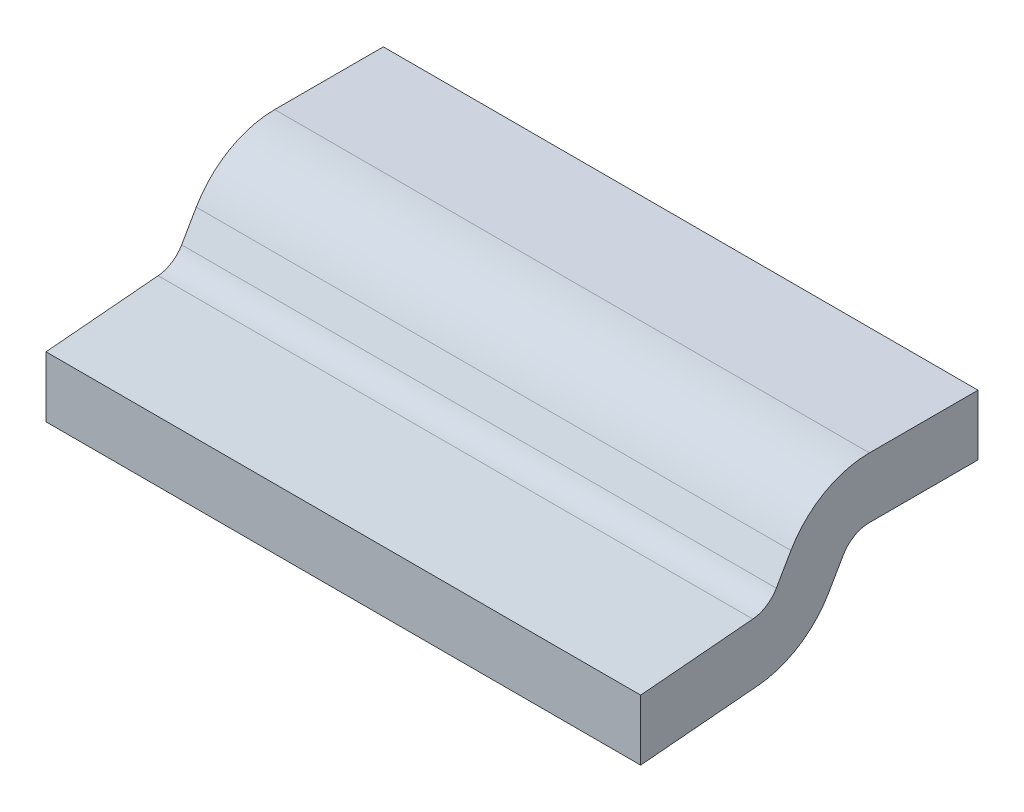
ISO-10303-21;
HEADER;
FILE_DESCRIPTION(('STEP AP214'),'2;1');
FILE_NAME('part.step','',(''),(''),'','','');
FILE_SCHEMA(('AUTOMOTIVE_DESIGN { 1 0 10303 214 1 1 1 1 }'));
ENDSEC;
DATA;
#1=APPLICATION_CONTEXT('core data for automotive mechanical design processes');
#2=APPLICATION_PROTOCOL_DEFINITION('international standard','automotive_design',2000,#1);
#3=PRODUCT_CONTEXT('',#1,'mechanical');
#4=PRODUCT('Part','Part','',(#3));
#5=PRODUCT_RELATED_PRODUCT_CATEGORY('part','',(#4));
#6=PRODUCT_DEFINITION_FORMATION('','',#4);
#7=PRODUCT_DEFINITION_CONTEXT('part definition',#1,'design');
#8=PRODUCT_DEFINITION('design','',#6,#7);
#9=PRODUCT_DEFINITION_SHAPE('','',#8);
#10=(LENGTH_UNIT() NAMED_UNIT(*) SI_UNIT(.MILLI.,.METRE.));
#11=(NAMED_UNIT(*) PLANE_ANGLE_UNIT() SI_UNIT($,.RADIAN.));
#12=(NAMED_UNIT(*) SI_UNIT($,.STERADIAN.) SOLID_ANGLE_UNIT());
#13=UNCERTAINTY_MEASURE_WITH_UNIT(LENGTH_MEASURE(1.E-05),#10,'distance_accuracy_value','');
#14=(GEOMETRIC_REPRESENTATION_CONTEXT(3) GLOBAL_UNCERTAINTY_ASSIGNED_CONTEXT((#13)) GLOBAL_UNIT_ASSIGNED_CONTEXT((#10,
#11,#12)) REPRESENTATION_CONTEXT('',''));
#15=CARTESIAN_POINT('',(0.,0.,0.));
#16=DIRECTION('',(0.,0.,1.));
#17=DIRECTION('',(1.,0.,0.));
#18=AXIS2_PLACEMENT_3D('',#15,#16,#17);
#19=CARTESIAN_POINT('',(-1.5,-0.22,0.9144));
#20=DIRECTION('',(0.,-0.996194698091747,-0.0871557427476379));
#21=DIRECTION('',(0.,0.0871557427476379,-0.996194698091747));
#22=AXIS2_PLACEMENT_3D('',#19,#20,#21);
#23=PLANE('',#22);
#24=DIRECTION('',(0.,0.0871557427476379,-0.996194698091747));
#25=VECTOR('',#24,1.);
#26=CARTESIAN_POINT('',(-1.5,-0.22,0.9144));
#27=LINE('',#26,#25);
#28=CARTESIAN_POINT('',(-1.5,-0.22,0.9144));
#29=VERTEX_POINT('',#28);
#30=CARTESIAN_POINT('',(-1.5,-0.168191562178,0.322226845968));
#31=VERTEX_POINT('',#30);
#32=EDGE_CURVE('E175',#29,#31,#27,.T.);
#33=ORIENTED_EDGE('',*,*,#32,.T.);
#34=DIRECTION('',(1.,0.,0.));
#35=VECTOR('',#34,1.);
#36=CARTESIAN_POINT('',(-1.5,-0.168191562178,0.322226845968));
#37=LINE('',#36,#35);
#38=CARTESIAN_POINT('',(1.5,-0.168191562178,0.322226845968));
#39=VERTEX_POINT('',#38);
#40=EDGE_CURVE('E11',#31,#39,#37,.T.);
#41=ORIENTED_EDGE('',*,*,#40,.T.);
#42=DIRECTION('',(0.,0.0871557427476379,-0.996194698091747));
#43=VECTOR('',#42,1.);
#44=CARTESIAN_POINT('',(1.5,-0.22,0.9144));
#45=LINE('',#44,#43);
#46=CARTESIAN_POINT('',(1.5,-0.22,0.9144));
#47=VERTEX_POINT('',#46);
#48=EDGE_CURVE('E195',#47,#39,#45,.T.);
#49=ORIENTED_EDGE('',*,*,#48,.F.);
#50=DIRECTION('',(1.,0.,0.));
#51=VECTOR('',#50,1.);
#52=CARTESIAN_POINT('',(-1.5,-0.22,0.9144));
#53=LINE('',#52,#51);
#54=EDGE_CURVE('E211',#29,#47,#53,.T.);
#55=ORIENTED_EDGE('',*,*,#54,.F.);
#56=EDGE_LOOP('',(#33,#41,#49,#55));
#57=FACE_BOUND('',#56,.T.);
#58=ADVANCED_FACE('F17',(#57),#23,.T.);
#59=CARTESIAN_POINT('',(-1.5,0.28726865379,0.362074451552));
#60=DIRECTION('',(-1.,0.,0.));
#61=DIRECTION('',(0.,-0.50000000000019,-0.866025403784329));
#62=AXIS2_PLACEMENT_3D('',#59,#60,#61);
#63=CYLINDRICAL_SURFACE('',#62,0.4572);
#64=CARTESIAN_POINT('',(1.5,0.28726865379,0.362074451552));
#65=DIRECTION('',(-1.,0.,0.));
#66=DIRECTION('',(0.,-0.50000000000019,-0.866025403784329));
#67=AXIS2_PLACEMENT_3D('',#64,#65,#66);
#68=CIRCLE('',#67,0.4572);
#69=CARTESIAN_POINT('',(1.5,0.05866865378978,-0.03387236305852));
#70=VERTEX_POINT('',#69);
#71=EDGE_CURVE('E25',#70,#39,#68,.T.);
#72=ORIENTED_EDGE('',*,*,#71,.T.);
#73=ORIENTED_EDGE('',*,*,#40,.F.);
#74=CARTESIAN_POINT('',(-1.5,0.28726865379,0.362074451552));
#75=DIRECTION('',(-1.,0.,0.));
#76=DIRECTION('',(0.,-0.50000000000019,-0.866025403784329));
#77=AXIS2_PLACEMENT_3D('',#74,#75,#76);
#78=CIRCLE('',#77,0.4572);
#79=CARTESIAN_POINT('',(-1.5,0.05866865378978,-0.03387236305852));
#80=VERTEX_POINT('',#79);
#81=EDGE_CURVE('E171',#80,#31,#78,.T.);
#82=ORIENTED_EDGE('',*,*,#81,.F.);
#83=DIRECTION('',(1.,0.,0.));
#84=VECTOR('',#83,1.);
#85=CARTESIAN_POINT('',(-1.5,0.05866865378978,-0.03387236305852));
#86=LINE('',#85,#84);
#87=EDGE_CURVE('E261',#80,#70,#86,.T.);
#88=ORIENTED_EDGE('',*,*,#87,.T.);
#89=EDGE_LOOP('',(#72,#73,#82,#88));
#90=FACE_BOUND('',#89,.T.);
#91=ADVANCED_FACE('F280',(#90),#63,.T.);
#92=CARTESIAN_POINT('',(1.5,0.,0.));
#93=DIRECTION('',(1.,0.,0.));
#94=DIRECTION('',(0.,1.,0.));
#95=AXIS2_PLACEMENT_3D('',#92,#93,#94);
#96=PLANE('',#95);
#97=ORIENTED_EDGE('',*,*,#48,.T.);
#98=ORIENTED_EDGE('',*,*,#71,.F.);
#99=DIRECTION('',(0.,0.866025403784329,-0.50000000000019));
#100=VECTOR('',#99,1.);
#101=CARTESIAN_POINT('',(1.5,0.05866865378978,-0.03387236305852));
#102=LINE('',#101,#100);
#103=CARTESIAN_POINT('',(1.5,0.1864,-0.107618090177));
#104=VERTEX_POINT('',#103);
#105=EDGE_CURVE('E258',#70,#104,#102,.T.);
#106=ORIENTED_EDGE('',*,*,#105,.T.);
#107=CARTESIAN_POINT('',(1.5,0.1102,-0.239600361714));
#108=DIRECTION('',(1.,0.,0.));
#109=DIRECTION('',(0.,1.,0.));
#110=AXIS2_PLACEMENT_3D('',#107,#108,#109);
#111=CIRCLE('',#110,0.1524);
#112=CARTESIAN_POINT('',(1.5,0.2626,-0.239600361714));
#113=VERTEX_POINT('',#112);
#114=EDGE_CURVE('E257',#113,#104,#111,.T.);
#115=ORIENTED_EDGE('',*,*,#114,.F.);
#116=DIRECTION('',(0.,0.,-1.));
#117=VECTOR('',#116,1.);
#118=CARTESIAN_POINT('',(1.5,0.2626,-0.239600361714));
#119=LINE('',#118,#117);
#120=CARTESIAN_POINT('',(1.5,0.2626,-0.7874));
#121=VERTEX_POINT('',#120);
#122=EDGE_CURVE('E250',#113,#121,#119,.T.);
#123=ORIENTED_EDGE('',*,*,#122,.T.);
#124=DIRECTION('',(0.,1.,0.));
#125=VECTOR('',#124,1.);
#126=CARTESIAN_POINT('',(1.5,0.2626,-0.7874));
#127=LINE('',#126,#125);
#128=CARTESIAN_POINT('',(1.5,0.5674,-0.7874));
#129=VERTEX_POINT('',#128);
#130=EDGE_CURVE('E243',#121,#129,#127,.T.);
#131=ORIENTED_EDGE('',*,*,#130,.T.);
#132=DIRECTION('',(0.,0.,1.));
#133=VECTOR('',#132,1.);
#134=CARTESIAN_POINT('',(1.5,0.5674,-0.7874));
#135=LINE('',#134,#133);
#136=CARTESIAN_POINT('',(1.5,0.5674,-0.239600361714));
#137=VERTEX_POINT('',#136);
#138=EDGE_CURVE('E167',#129,#137,#135,.T.);
#139=ORIENTED_EDGE('',*,*,#138,.T.);
#140=CARTESIAN_POINT('',(1.5,0.1102,-0.239600361714));
#141=DIRECTION('',(-1.,0.,0.));
#142=DIRECTION('',(0.,0.50000000000019,0.866025403784329));
#143=AXIS2_PLACEMENT_3D('',#140,#141,#142);
#144=CIRCLE('',#143,0.4572);
#145=CARTESIAN_POINT('',(1.5,0.3388,0.156346452897));
#146=VERTEX_POINT('',#145);
#147=EDGE_CURVE('E233',#146,#137,#144,.T.);
#148=ORIENTED_EDGE('',*,*,#147,.F.);
#149=DIRECTION('',(0.,-0.866025403784329,0.50000000000019));
#150=VECTOR('',#149,1.);
#151=CARTESIAN_POINT('',(1.5,0.3388,0.156346452897));
#152=LINE('',#151,#150);
#153=CARTESIAN_POINT('',(1.5,0.21106865379,0.230092180015));
#154=VERTEX_POINT('',#153);
#155=EDGE_CURVE('E226',#146,#154,#152,.T.);
#156=ORIENTED_EDGE('',*,*,#155,.T.);
#157=CARTESIAN_POINT('',(1.5,0.28726865379,0.362074451552));
#158=DIRECTION('',(1.,0.,0.));
#159=DIRECTION('',(0.,-0.996194698091747,-0.0871557427476379));
#160=AXIS2_PLACEMENT_3D('',#157,#158,#159);
#161=CIRCLE('',#160,0.1524);
#162=CARTESIAN_POINT('',(1.5,0.135448581801,0.348791916357));
#163=VERTEX_POINT('',#162);
#164=EDGE_CURVE('E144',#163,#154,#161,.T.);
#165=ORIENTED_EDGE('',*,*,#164,.F.);
#166=DIRECTION('',(0.,-0.0871557427476379,0.996194698091747));
#167=VECTOR('',#166,1.);
#168=CARTESIAN_POINT('',(1.5,0.135448581801,0.348791916357));
#169=LINE('',#168,#167);
#170=CARTESIAN_POINT('',(1.5,0.08596428648321,0.9144));
#171=VERTEX_POINT('',#170);
#172=EDGE_CURVE('E140',#163,#171,#169,.T.);
#173=ORIENTED_EDGE('',*,*,#172,.T.);
#174=DIRECTION('',(0.,1.,0.));
#175=VECTOR('',#174,1.);
#176=CARTESIAN_POINT('',(1.5,-0.22,0.9144));
#177=LINE('',#176,#175);
#178=EDGE_CURVE('E183',#47,#171,#177,.T.);
#179=ORIENTED_EDGE('',*,*,#178,.F.);
#180=EDGE_LOOP('',(#97,#98,#106,#115,#123,#131,#139,#148,#156,#165,#173,#179));
#181=FACE_BOUND('',#180,.T.);
#182=ADVANCED_FACE('F274',(#181),#96,.T.);
#183=CARTESIAN_POINT('',(-1.5,-0.147448211667,0.08512926469761));
#184=DIRECTION('',(0.,-0.50000000000019,-0.866025403784329));
#185=DIRECTION('',(0.,-0.866025403784329,0.50000000000019));
#186=AXIS2_PLACEMENT_3D('',#183,#184,#185);
#187=PLANE('',#186);
#188=ORIENTED_EDGE('',*,*,#87,.F.);
#189=DIRECTION('',(0.,-0.866025403784329,0.50000000000019));
#190=VECTOR('',#189,1.);
#191=CARTESIAN_POINT('',(-1.5,0.1864,-0.107618090177));
#192=LINE('',#191,#190);
#193=CARTESIAN_POINT('',(-1.5,0.1864,-0.107618090177));
#194=VERTEX_POINT('',#193);
#195=EDGE_CURVE('E176',#194,#80,#192,.T.);
#196=ORIENTED_EDGE('',*,*,#195,.F.);
#197=DIRECTION('',(1.,0.,0.));
#198=VECTOR('',#197,1.);
#199=CARTESIAN_POINT('',(-1.5,0.1864,-0.107618090177));
#200=LINE('',#199,#198);
#201=EDGE_CURVE('E265',#194,#104,#200,.T.);
#202=ORIENTED_EDGE('',*,*,#201,.T.);
#203=ORIENTED_EDGE('',*,*,#105,.F.);
#204=EDGE_LOOP('',(#188,#196,#202,#203));
#205=FACE_BOUND('',#204,.T.);
#206=ADVANCED_FACE('F282',(#205),#187,.T.);
#207=CARTESIAN_POINT('',(-1.5,0.1102,-0.239600361714));
#208=DIRECTION('',(1.,0.,0.));
#209=DIRECTION('',(0.,1.,0.));
#210=AXIS2_PLACEMENT_3D('',#207,#208,#209);
#211=CYLINDRICAL_SURFACE('',#210,0.1524);
#212=ORIENTED_EDGE('',*,*,#114,.T.);
#213=ORIENTED_EDGE('',*,*,#201,.F.);
#214=CARTESIAN_POINT('',(-1.5,0.1102,-0.239600361714));
#215=DIRECTION('',(1.,0.,0.));
#216=DIRECTION('',(0.,1.,0.));
#217=AXIS2_PLACEMENT_3D('',#214,#215,#216);
#218=CIRCLE('',#217,0.1524);
#219=CARTESIAN_POINT('',(-1.5,0.2626,-0.239600361714));
#220=VERTEX_POINT('',#219);
#221=EDGE_CURVE('E184',#220,#194,#218,.T.);
#222=ORIENTED_EDGE('',*,*,#221,.F.);
#223=DIRECTION('',(1.,0.,0.));
#224=VECTOR('',#223,1.);
#225=CARTESIAN_POINT('',(-1.5,0.2626,-0.239600361714));
#226=LINE('',#225,#224);
#227=EDGE_CURVE('E253',#220,#113,#226,.T.);
#228=ORIENTED_EDGE('',*,*,#227,.T.);
#229=EDGE_LOOP('',(#212,#213,#222,#228));
#230=FACE_BOUND('',#229,.T.);
#231=ADVANCED_FACE('F286',(#230),#211,.F.);
#232=CARTESIAN_POINT('',(-1.5,0.2626,-0.151612180689));
#233=DIRECTION('',(0.,-1.,0.));
#234=DIRECTION('',(0.,0.,-1.));
#235=AXIS2_PLACEMENT_3D('',#232,#233,#234);
#236=PLANE('',#235);
#237=DIRECTION('',(1.,0.,0.));
#238=VECTOR('',#237,1.);
#239=CARTESIAN_POINT('',(-1.5,0.2626,-0.7874));
#240=LINE('',#239,#238);
#241=CARTESIAN_POINT('',(-1.5,0.2626,-0.7874));
#242=VERTEX_POINT('',#241);
#243=EDGE_CURVE('E246',#242,#121,#240,.T.);
#244=ORIENTED_EDGE('',*,*,#243,.T.);
#245=ORIENTED_EDGE('',*,*,#122,.F.);
#246=ORIENTED_EDGE('',*,*,#227,.F.);
#247=DIRECTION('',(0.,0.,-1.));
#248=VECTOR('',#247,1.);
#249=CARTESIAN_POINT('',(-1.5,0.2626,-0.239600361714));
#250=LINE('',#249,#248);
#251=EDGE_CURVE('E188',#220,#242,#250,.T.);
#252=ORIENTED_EDGE('',*,*,#251,.T.);
#253=EDGE_LOOP('',(#244,#245,#246,#252));
#254=FACE_BOUND('',#253,.T.);
#255=ADVANCED_FACE('F289',(#254),#236,.T.);
#256=CARTESIAN_POINT('',(-1.5,0.2626,-0.7874));
#257=DIRECTION('',(0.,0.,-1.));
#258=DIRECTION('',(0.,-1.,0.));
#259=AXIS2_PLACEMENT_3D('',#256,#257,#258);
#260=PLANE('',#259);
#261=DIRECTION('',(1.,0.,0.));
#262=VECTOR('',#261,1.);
#263=CARTESIAN_POINT('',(-1.5,0.5674,-0.7874));
#264=LINE('',#263,#262);
#265=CARTESIAN_POINT('',(-1.5,0.5674,-0.7874));
#266=VERTEX_POINT('',#265);
#267=EDGE_CURVE('E168',#266,#129,#264,.T.);
#268=ORIENTED_EDGE('',*,*,#267,.T.);
#269=ORIENTED_EDGE('',*,*,#130,.F.);
#270=ORIENTED_EDGE('',*,*,#243,.F.);
#271=DIRECTION('',(0.,1.,0.));
#272=VECTOR('',#271,1.);
#273=CARTESIAN_POINT('',(-1.5,0.2626,-0.7874));
#274=LINE('',#273,#272);
#275=EDGE_CURVE('E196',#242,#266,#274,.T.);
#276=ORIENTED_EDGE('',*,*,#275,.T.);
#277=EDGE_LOOP('',(#268,#269,#270,#276));
#278=FACE_BOUND('',#277,.T.);
#279=ADVANCED_FACE('F293',(#278),#260,.T.);
#280=CARTESIAN_POINT('',(-1.5,0.5674,-0.7874));
#281=DIRECTION('',(0.,1.,0.));
#282=DIRECTION('',(1.,0.,0.));
#283=AXIS2_PLACEMENT_3D('',#280,#281,#282);
#284=PLANE('',#283);
#285=DIRECTION('',(1.,0.,0.));
#286=VECTOR('',#285,1.);
#287=CARTESIAN_POINT('',(-1.5,0.5674,-0.239600361714));
#288=LINE('',#287,#286);
#289=CARTESIAN_POINT('',(-1.5,0.5674,-0.239600361714));
#290=VERTEX_POINT('',#289);
#291=EDGE_CURVE('E169',#290,#137,#288,.T.);
#292=ORIENTED_EDGE('',*,*,#291,.T.);
#293=ORIENTED_EDGE('',*,*,#138,.F.);
#294=ORIENTED_EDGE('',*,*,#267,.F.);
#295=DIRECTION('',(0.,0.,1.));
#296=VECTOR('',#295,1.);
#297=CARTESIAN_POINT('',(-1.5,0.5674,-0.7874));
#298=LINE('',#297,#296);
#299=EDGE_CURVE('E192',#266,#290,#298,.T.);
#300=ORIENTED_EDGE('',*,*,#299,.T.);
#301=EDGE_LOOP('',(#292,#293,#294,#300));
#302=FACE_BOUND('',#301,.T.);
#303=ADVANCED_FACE('F296',(#302),#284,.T.);
#304=CARTESIAN_POINT('',(-1.5,0.1102,-0.239600361714));
#305=DIRECTION('',(-1.,0.,0.));
#306=DIRECTION('',(0.,0.50000000000019,0.866025403784329));
#307=AXIS2_PLACEMENT_3D('',#304,#305,#306);
#308=CYLINDRICAL_SURFACE('',#307,0.4572);
#309=ORIENTED_EDGE('',*,*,#147,.T.);
#310=ORIENTED_EDGE('',*,*,#291,.F.);
#311=CARTESIAN_POINT('',(-1.5,0.1102,-0.239600361714));
#312=DIRECTION('',(-1.,0.,0.));
#313=DIRECTION('',(0.,0.50000000000019,0.866025403784329));
#314=AXIS2_PLACEMENT_3D('',#311,#312,#313);
#315=CIRCLE('',#314,0.4572);
#316=CARTESIAN_POINT('',(-1.5,0.3388,0.156346452897));
#317=VERTEX_POINT('',#316);
#318=EDGE_CURVE('E179',#317,#290,#315,.T.);
#319=ORIENTED_EDGE('',*,*,#318,.F.);
#320=DIRECTION('',(1.,0.,0.));
#321=VECTOR('',#320,1.);
#322=CARTESIAN_POINT('',(-1.5,0.3388,0.156346452897));
#323=LINE('',#322,#321);
#324=EDGE_CURVE('E229',#317,#146,#323,.T.);
#325=ORIENTED_EDGE('',*,*,#324,.T.);
#326=EDGE_LOOP('',(#309,#310,#319,#325));
#327=FACE_BOUND('',#326,.T.);
#328=ADVANCED_FACE('F300',(#327),#308,.T.);
#329=CARTESIAN_POINT('',(-1.5,0.1524,0.263964543073));
#330=DIRECTION('',(0.,0.50000000000019,0.866025403784329));
#331=DIRECTION('',(1.,0.,0.));
#332=AXIS2_PLACEMENT_3D('',#329,#330,#331);
#333=PLANE('',#332);
#334=DIRECTION('',(1.,0.,0.));
#335=VECTOR('',#334,1.);
#336=CARTESIAN_POINT('',(-1.5,0.21106865379,0.230092180015));
#337=LINE('',#336,#335);
#338=CARTESIAN_POINT('',(-1.5,0.21106865379,0.230092180015));
#339=VERTEX_POINT('',#338);
#340=EDGE_CURVE('E150',#339,#154,#337,.T.);
#341=ORIENTED_EDGE('',*,*,#340,.T.);
#342=ORIENTED_EDGE('',*,*,#155,.F.);
#343=ORIENTED_EDGE('',*,*,#324,.F.);
#344=DIRECTION('',(0.,0.866025403784329,-0.50000000000019));
#345=VECTOR('',#344,1.);
#346=CARTESIAN_POINT('',(-1.5,0.21106865379,0.230092180015));
#347=LINE('',#346,#345);
#348=EDGE_CURVE('E155',#339,#317,#347,.T.);
#349=ORIENTED_EDGE('',*,*,#348,.F.);
#350=EDGE_LOOP('',(#341,#342,#343,#349));
#351=FACE_BOUND('',#350,.T.);
#352=ADVANCED_FACE('F303',(#351),#333,.T.);
#353=CARTESIAN_POINT('',(-1.5,0.28726865379,0.362074451552));
#354=DIRECTION('',(1.,0.,0.));
#355=DIRECTION('',(0.,-0.996194698091747,-0.0871557427476379));
#356=AXIS2_PLACEMENT_3D('',#353,#354,#355);
#357=CYLINDRICAL_SURFACE('',#356,0.1524);
#358=ORIENTED_EDGE('',*,*,#164,.T.);
#359=ORIENTED_EDGE('',*,*,#340,.F.);
#360=CARTESIAN_POINT('',(-1.5,0.28726865379,0.362074451552));
#361=DIRECTION('',(1.,0.,0.));
#362=DIRECTION('',(0.,-0.996194698091747,-0.0871557427476379));
#363=AXIS2_PLACEMENT_3D('',#360,#361,#362);
#364=CIRCLE('',#363,0.1524);
#365=CARTESIAN_POINT('',(-1.5,0.135448581801,0.348791916357));
#366=VERTEX_POINT('',#365);
#367=EDGE_CURVE('E147',#366,#339,#364,.T.);
#368=ORIENTED_EDGE('',*,*,#367,.F.);
#369=DIRECTION('',(1.,0.,0.));
#370=VECTOR('',#369,1.);
#371=CARTESIAN_POINT('',(-1.5,0.135448581801,0.348791916357));
#372=LINE('',#371,#370);
#373=EDGE_CURVE('E134',#366,#163,#372,.T.);
#374=ORIENTED_EDGE('',*,*,#373,.T.);
#375=EDGE_LOOP('',(#358,#359,#368,#374));
#376=FACE_BOUND('',#375,.T.);
#377=ADVANCED_FACE('F148',(#376),#357,.F.);
#378=CARTESIAN_POINT('',(-1.5,0.142363031971,0.269759389267));
#379=DIRECTION('',(0.,0.996194698091747,0.0871557427476379));
#380=DIRECTION('',(1.,0.,0.));
#381=AXIS2_PLACEMENT_3D('',#378,#379,#380);
#382=PLANE('',#381);
#383=ORIENTED_EDGE('',*,*,#172,.F.);
#384=ORIENTED_EDGE('',*,*,#373,.F.);
#385=DIRECTION('',(0.,-0.0871557427476379,0.996194698091747));
#386=VECTOR('',#385,1.);
#387=CARTESIAN_POINT('',(-1.5,0.135448581801,0.348791916357));
#388=LINE('',#387,#386);
#389=CARTESIAN_POINT('',(-1.5,0.08596428648321,0.9144));
#390=VERTEX_POINT('',#389);
#391=EDGE_CURVE('E139',#366,#390,#388,.T.);
#392=ORIENTED_EDGE('',*,*,#391,.T.);
#393=DIRECTION('',(1.,0.,0.));
#394=VECTOR('',#393,1.);
#395=CARTESIAN_POINT('',(-1.5,0.08596428648321,0.9144));
#396=LINE('',#395,#394);
#397=EDGE_CURVE('E180',#390,#171,#396,.T.);
#398=ORIENTED_EDGE('',*,*,#397,.T.);
#399=EDGE_LOOP('',(#383,#384,#392,#398));
#400=FACE_BOUND('',#399,.T.);
#401=ADVANCED_FACE('F136',(#400),#382,.T.);
#402=CARTESIAN_POINT('',(1.8,-0.22,0.9144));
#403=DIRECTION('',(0.,0.,-1.));
#404=DIRECTION('',(0.,-1.,0.));
#405=AXIS2_PLACEMENT_3D('',#402,#403,#404);
#406=PLANE('',#405);
#407=ORIENTED_EDGE('',*,*,#54,.T.);
#408=ORIENTED_EDGE('',*,*,#178,.T.);
#409=ORIENTED_EDGE('',*,*,#397,.F.);
#410=DIRECTION('',(0.,1.,0.));
#411=VECTOR('',#410,1.);
#412=CARTESIAN_POINT('',(-1.5,-0.22,0.9144));
#413=LINE('',#412,#411);
#414=EDGE_CURVE('E161',#29,#390,#413,.T.);
#415=ORIENTED_EDGE('',*,*,#414,.F.);
#416=EDGE_LOOP('',(#407,#408,#409,#415));
#417=FACE_BOUND('',#416,.T.);
#418=ADVANCED_FACE('F276',(#417),#406,.F.);
#419=CARTESIAN_POINT('',(-1.5,0.,0.));
#420=DIRECTION('',(1.,0.,0.));
#421=DIRECTION('',(0.,1.,0.));
#422=AXIS2_PLACEMENT_3D('',#419,#420,#421);
#423=PLANE('',#422);
#424=ORIENTED_EDGE('',*,*,#391,.F.);
#425=ORIENTED_EDGE('',*,*,#367,.T.);
#426=ORIENTED_EDGE('',*,*,#348,.T.);
#427=ORIENTED_EDGE('',*,*,#318,.T.);
#428=ORIENTED_EDGE('',*,*,#299,.F.);
#429=ORIENTED_EDGE('',*,*,#275,.F.);
#430=ORIENTED_EDGE('',*,*,#251,.F.);
#431=ORIENTED_EDGE('',*,*,#221,.T.);
#432=ORIENTED_EDGE('',*,*,#195,.T.);
#433=ORIENTED_EDGE('',*,*,#81,.T.);
#434=ORIENTED_EDGE('',*,*,#32,.F.);
#435=ORIENTED_EDGE('',*,*,#414,.T.);
#436=EDGE_LOOP('',(#424,#425,#426,#427,#428,#429,#430,#431,#432,#433,#434,#435));
#437=FACE_BOUND('',#436,.T.);
#438=ADVANCED_FACE('F158',(#437),#423,.F.);
#439=CLOSED_SHELL('',(#58,#91,#182,#206,#231,#255,#279,#303,#328,#352,#377,#401,#418,#438));
#440=MANIFOLD_SOLID_BREP('B1',#439);
#441=ADVANCED_BREP_SHAPE_REPRESENTATION('',(#18,#440),#14);
#442=SHAPE_DEFINITION_REPRESENTATION(#9,#441);
ENDSEC;
END-ISO-10303-21;
